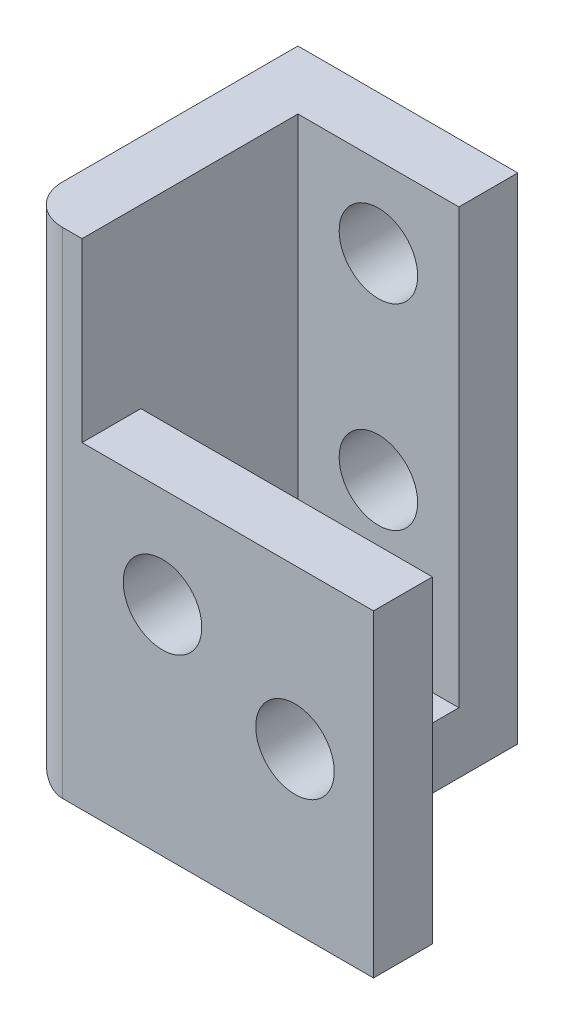
ISO-10303-21;
HEADER;
FILE_DESCRIPTION(('STEP AP214'),'2;1');
FILE_NAME('part.step','',(''),(''),'','','');
FILE_SCHEMA(('AUTOMOTIVE_DESIGN { 1 0 10303 214 1 1 1 1 }'));
ENDSEC;
DATA;
#1=APPLICATION_CONTEXT('core data for automotive mechanical design processes');
#2=APPLICATION_PROTOCOL_DEFINITION('international standard','automotive_design',2000,#1);
#3=PRODUCT_CONTEXT('',#1,'mechanical');
#4=PRODUCT('Part','Part','',(#3));
#5=PRODUCT_RELATED_PRODUCT_CATEGORY('part','',(#4));
#6=PRODUCT_DEFINITION_FORMATION('','',#4);
#7=PRODUCT_DEFINITION_CONTEXT('part definition',#1,'design');
#8=PRODUCT_DEFINITION('design','',#6,#7);
#9=PRODUCT_DEFINITION_SHAPE('','',#8);
#10=(LENGTH_UNIT() NAMED_UNIT(*) SI_UNIT(.MILLI.,.METRE.));
#11=(NAMED_UNIT(*) PLANE_ANGLE_UNIT() SI_UNIT($,.RADIAN.));
#12=(NAMED_UNIT(*) SI_UNIT($,.STERADIAN.) SOLID_ANGLE_UNIT());
#13=UNCERTAINTY_MEASURE_WITH_UNIT(LENGTH_MEASURE(1.E-05),#10,'distance_accuracy_value','');
#14=(GEOMETRIC_REPRESENTATION_CONTEXT(3) GLOBAL_UNCERTAINTY_ASSIGNED_CONTEXT((#13)) GLOBAL_UNIT_ASSIGNED_CONTEXT((#10,
#11,#12)) REPRESENTATION_CONTEXT('',''));
#15=CARTESIAN_POINT('',(0.,0.,0.));
#16=DIRECTION('',(0.,0.,1.));
#17=DIRECTION('',(1.,0.,0.));
#18=AXIS2_PLACEMENT_3D('',#15,#16,#17);
#19=CARTESIAN_POINT('',(-24.25,-5.,5.));
#20=DIRECTION('',(0.,0.,-1.));
#21=DIRECTION('',(-1.,0.,0.));
#22=AXIS2_PLACEMENT_3D('',#19,#20,#21);
#23=CYLINDRICAL_SURFACE('',#22,2.);
#24=CARTESIAN_POINT('',(-24.25,-5.,8.));
#25=DIRECTION('',(0.,0.,1.));
#26=DIRECTION('',(1.,0.,0.));
#27=AXIS2_PLACEMENT_3D('',#24,#25,#26);
#28=CIRCLE('',#27,2.);
#29=CARTESIAN_POINT('',(-22.25,-5.,8.));
#30=VERTEX_POINT('',#29);
#31=EDGE_CURVE('E206',#30,#30,#28,.T.);
#32=ORIENTED_EDGE('',*,*,#31,.T.);
#33=EDGE_LOOP('',(#32));
#34=FACE_BOUND('',#33,.T.);
#35=CARTESIAN_POINT('',(-24.25,-5.,5.));
#36=DIRECTION('',(0.,0.,-1.));
#37=DIRECTION('',(-1.,0.,0.));
#38=AXIS2_PLACEMENT_3D('',#35,#36,#37);
#39=CIRCLE('',#38,2.);
#40=CARTESIAN_POINT('',(-26.25,-5.,5.));
#41=VERTEX_POINT('',#40);
#42=EDGE_CURVE('E11',#41,#41,#39,.T.);
#43=ORIENTED_EDGE('',*,*,#42,.T.);
#44=EDGE_LOOP('',(#43));
#45=FACE_BOUND('',#44,.T.);
#46=ADVANCED_FACE('F37',(#34,#45),#23,.F.);
#47=CARTESIAN_POINT('',(-24.25,5.,5.));
#48=DIRECTION('',(0.,0.,-1.));
#49=DIRECTION('',(-1.,0.,0.));
#50=AXIS2_PLACEMENT_3D('',#47,#48,#49);
#51=CYLINDRICAL_SURFACE('',#50,1.99999999999997);
#52=CARTESIAN_POINT('',(-24.25,5.,8.));
#53=DIRECTION('',(0.,0.,1.));
#54=DIRECTION('',(1.,0.,0.));
#55=AXIS2_PLACEMENT_3D('',#52,#53,#54);
#56=CIRCLE('',#55,1.99999999999997);
#57=CARTESIAN_POINT('',(-22.25,5.,8.));
#58=VERTEX_POINT('',#57);
#59=EDGE_CURVE('E209',#58,#58,#56,.T.);
#60=ORIENTED_EDGE('',*,*,#59,.T.);
#61=EDGE_LOOP('',(#60));
#62=FACE_BOUND('',#61,.T.);
#63=CARTESIAN_POINT('',(-24.25,5.,5.));
#64=DIRECTION('',(0.,0.,-1.));
#65=DIRECTION('',(-1.,0.,0.));
#66=AXIS2_PLACEMENT_3D('',#63,#64,#65);
#67=CIRCLE('',#66,1.99999999999997);
#68=CARTESIAN_POINT('',(-26.25,5.,5.));
#69=VERTEX_POINT('',#68);
#70=EDGE_CURVE('E45',#69,#69,#67,.T.);
#71=ORIENTED_EDGE('',*,*,#70,.T.);
#72=EDGE_LOOP('',(#71));
#73=FACE_BOUND('',#72,.T.);
#74=ADVANCED_FACE('F238',(#62,#73),#51,.F.);
#75=CARTESIAN_POINT('',(0.,0.,8.));
#76=DIRECTION('',(0.,0.,1.));
#77=DIRECTION('',(1.,0.,0.));
#78=AXIS2_PLACEMENT_3D('',#75,#76,#77);
#79=PLANE('',#78);
#80=ORIENTED_EDGE('',*,*,#59,.F.);
#81=EDGE_LOOP('',(#80));
#82=FACE_BOUND('',#81,.T.);
#83=ORIENTED_EDGE('',*,*,#31,.F.);
#84=EDGE_LOOP('',(#83));
#85=FACE_BOUND('',#84,.T.);
#86=DIRECTION('',(0.,-1.,0.));
#87=VECTOR('',#86,1.);
#88=CARTESIAN_POINT('',(-28.35,-9.9,8.));
#89=LINE('',#88,#87);
#90=CARTESIAN_POINT('',(-28.35,9.1,8.));
#91=VERTEX_POINT('',#90);
#92=CARTESIAN_POINT('',(-28.35,-13.,8.));
#93=VERTEX_POINT('',#92);
#94=EDGE_CURVE('E216',#91,#93,#89,.T.);
#95=ORIENTED_EDGE('',*,*,#94,.T.);
#96=DIRECTION('',(-1.,0.,0.));
#97=VECTOR('',#96,1.);
#98=CARTESIAN_POINT('',(-28.35,-13.,8.));
#99=LINE('',#98,#97);
#100=CARTESIAN_POINT('',(-20.15,-13.,8.));
#101=VERTEX_POINT('',#100);
#102=EDGE_CURVE('E154',#101,#93,#99,.T.);
#103=ORIENTED_EDGE('',*,*,#102,.F.);
#104=DIRECTION('',(0.,1.,0.));
#105=VECTOR('',#104,1.);
#106=CARTESIAN_POINT('',(-20.15,-9.9,8.));
#107=LINE('',#106,#105);
#108=CARTESIAN_POINT('',(-20.15,9.1,8.));
#109=VERTEX_POINT('',#108);
#110=EDGE_CURVE('E141',#101,#109,#107,.T.);
#111=ORIENTED_EDGE('',*,*,#110,.T.);
#112=DIRECTION('',(-1.,0.,0.));
#113=VECTOR('',#112,1.);
#114=CARTESIAN_POINT('',(-20.15,9.1,8.));
#115=LINE('',#114,#113);
#116=EDGE_CURVE('E214',#109,#91,#115,.T.);
#117=ORIENTED_EDGE('',*,*,#116,.T.);
#118=EDGE_LOOP('',(#95,#103,#111,#117));
#119=FACE_BOUND('',#118,.T.);
#120=ADVANCED_FACE('F256',(#82,#85,#119),#79,.T.);
#121=CARTESIAN_POINT('',(-28.35,9.1,19.));
#122=DIRECTION('',(-1.,0.,0.));
#123=DIRECTION('',(0.,0.,1.));
#124=AXIS2_PLACEMENT_3D('',#121,#122,#123);
#125=PLANE('',#124);
#126=DIRECTION('',(0.,0.,1.));
#127=VECTOR('',#126,1.);
#128=CARTESIAN_POINT('',(-28.35,-13.,-0.766413177577252));
#129=LINE('',#128,#127);
#130=CARTESIAN_POINT('',(-28.35,-13.,16.));
#131=VERTEX_POINT('',#130);
#132=EDGE_CURVE('E144',#93,#131,#129,.T.);
#133=ORIENTED_EDGE('',*,*,#132,.F.);
#134=ORIENTED_EDGE('',*,*,#94,.F.);
#135=DIRECTION('',(0.,0.,-1.));
#136=VECTOR('',#135,1.);
#137=CARTESIAN_POINT('',(-28.35,9.1,19.));
#138=LINE('',#137,#136);
#139=CARTESIAN_POINT('',(-28.35,9.1,19.));
#140=VERTEX_POINT('',#139);
#141=EDGE_CURVE('E203',#140,#91,#138,.T.);
#142=ORIENTED_EDGE('',*,*,#141,.F.);
#143=DIRECTION('',(0.,1.,0.));
#144=VECTOR('',#143,1.);
#145=CARTESIAN_POINT('',(-28.35,9.1,19.));
#146=LINE('',#145,#144);
#147=CARTESIAN_POINT('',(-28.35,0.0999999999999994,19.));
#148=VERTEX_POINT('',#147);
#149=EDGE_CURVE('E195',#148,#140,#146,.T.);
#150=ORIENTED_EDGE('',*,*,#149,.F.);
#151=DIRECTION('',(0.,0.,1.));
#152=VECTOR('',#151,1.);
#153=CARTESIAN_POINT('',(-28.35,0.0999999999999994,16.));
#154=LINE('',#153,#152);
#155=CARTESIAN_POINT('',(-28.35,0.0999999999999994,16.));
#156=VERTEX_POINT('',#155);
#157=EDGE_CURVE('E186',#156,#148,#154,.T.);
#158=ORIENTED_EDGE('',*,*,#157,.F.);
#159=DIRECTION('',(0.,-1.,0.));
#160=VECTOR('',#159,1.);
#161=CARTESIAN_POINT('',(-28.35,-9.9,16.));
#162=LINE('',#161,#160);
#163=EDGE_CURVE('E171',#156,#131,#162,.T.);
#164=ORIENTED_EDGE('',*,*,#163,.T.);
#165=EDGE_LOOP('',(#133,#134,#142,#150,#158,#164));
#166=FACE_BOUND('',#165,.T.);
#167=ADVANCED_FACE('F276',(#166),#125,.F.);
#168=CARTESIAN_POINT('',(-28.35,-13.,-0.766413177577252));
#169=DIRECTION('',(0.,-1.,0.));
#170=DIRECTION('',(1.,0.,0.));
#171=AXIS2_PLACEMENT_3D('',#168,#169,#170);
#172=PLANE('',#171);
#173=DIRECTION('',(0.,0.,1.));
#174=VECTOR('',#173,1.);
#175=CARTESIAN_POINT('',(-20.15,-13.,-0.766413177577252));
#176=LINE('',#175,#174);
#177=CARTESIAN_POINT('',(-20.15,-13.,16.));
#178=VERTEX_POINT('',#177);
#179=EDGE_CURVE('E135',#101,#178,#176,.T.);
#180=ORIENTED_EDGE('',*,*,#179,.F.);
#181=ORIENTED_EDGE('',*,*,#102,.T.);
#182=ORIENTED_EDGE('',*,*,#132,.T.);
#183=DIRECTION('',(1.,0.,0.));
#184=VECTOR('',#183,1.);
#185=CARTESIAN_POINT('',(-28.35,-13.,16.));
#186=LINE('',#185,#184);
#187=EDGE_CURVE('E129',#131,#178,#186,.T.);
#188=ORIENTED_EDGE('',*,*,#187,.T.);
#189=EDGE_LOOP('',(#180,#181,#182,#188));
#190=FACE_BOUND('',#189,.T.);
#191=ADVANCED_FACE('F147',(#190),#172,.F.);
#192=CARTESIAN_POINT('',(-20.15,0.,5.));
#193=DIRECTION('',(-1.,0.,0.));
#194=DIRECTION('',(0.,0.,1.));
#195=AXIS2_PLACEMENT_3D('',#192,#193,#194);
#196=PLANE('',#195);
#197=DIRECTION('',(0.,1.,0.));
#198=VECTOR('',#197,1.);
#199=CARTESIAN_POINT('',(-20.15,-16.1,5.));
#200=LINE('',#199,#198);
#201=CARTESIAN_POINT('',(-20.15,-16.1,5.));
#202=VERTEX_POINT('',#201);
#203=CARTESIAN_POINT('',(-20.15,9.1,5.));
#204=VERTEX_POINT('',#203);
#205=EDGE_CURVE('E162',#202,#204,#200,.T.);
#206=ORIENTED_EDGE('',*,*,#205,.T.);
#207=DIRECTION('',(0.,0.,-1.));
#208=VECTOR('',#207,1.);
#209=CARTESIAN_POINT('',(-20.15,9.1,8.));
#210=LINE('',#209,#208);
#211=EDGE_CURVE('E219',#109,#204,#210,.T.);
#212=ORIENTED_EDGE('',*,*,#211,.F.);
#213=ORIENTED_EDGE('',*,*,#110,.F.);
#214=ORIENTED_EDGE('',*,*,#179,.T.);
#215=DIRECTION('',(0.,-1.,0.));
#216=VECTOR('',#215,1.);
#217=CARTESIAN_POINT('',(-20.15,-16.1,16.));
#218=LINE('',#217,#216);
#219=CARTESIAN_POINT('',(-20.15,-16.1,16.));
#220=VERTEX_POINT('',#219);
#221=EDGE_CURVE('E125',#178,#220,#218,.T.);
#222=ORIENTED_EDGE('',*,*,#221,.T.);
#223=DIRECTION('',(0.,0.,1.));
#224=VECTOR('',#223,1.);
#225=CARTESIAN_POINT('',(-20.15,-16.1,5.));
#226=LINE('',#225,#224);
#227=EDGE_CURVE('E160',#202,#220,#226,.T.);
#228=ORIENTED_EDGE('',*,*,#227,.F.);
#229=EDGE_LOOP('',(#206,#212,#213,#214,#222,#228));
#230=FACE_BOUND('',#229,.T.);
#231=ADVANCED_FACE('F139',(#230),#196,.F.);
#232=CARTESIAN_POINT('',(-17.5,-8.,16.));
#233=DIRECTION('',(0.,0.,1.));
#234=DIRECTION('',(1.,0.,0.));
#235=AXIS2_PLACEMENT_3D('',#232,#233,#234);
#236=CYLINDRICAL_SURFACE('',#235,2.);
#237=CARTESIAN_POINT('',(-17.5,-8.,16.));
#238=DIRECTION('',(0.,0.,1.));
#239=DIRECTION('',(1.,0.,0.));
#240=AXIS2_PLACEMENT_3D('',#237,#238,#239);
#241=CIRCLE('',#240,2.);
#242=CARTESIAN_POINT('',(-15.5,-8.,16.));
#243=VERTEX_POINT('',#242);
#244=EDGE_CURVE('E165',#243,#243,#241,.T.);
#245=ORIENTED_EDGE('',*,*,#244,.F.);
#246=EDGE_LOOP('',(#245));
#247=FACE_BOUND('',#246,.T.);
#248=CARTESIAN_POINT('',(-17.5,-8.,19.));
#249=DIRECTION('',(0.,0.,1.));
#250=DIRECTION('',(1.,0.,0.));
#251=AXIS2_PLACEMENT_3D('',#248,#249,#250);
#252=CIRCLE('',#251,2.);
#253=CARTESIAN_POINT('',(-15.5,-8.,19.));
#254=VERTEX_POINT('',#253);
#255=EDGE_CURVE('E164',#254,#254,#252,.T.);
#256=ORIENTED_EDGE('',*,*,#255,.T.);
#257=EDGE_LOOP('',(#256));
#258=FACE_BOUND('',#257,.T.);
#259=ADVANCED_FACE('F296',(#247,#258),#236,.F.);
#260=CARTESIAN_POINT('',(-24.25,-5.,40.4460894756599));
#261=DIRECTION('',(0.,0.,-1.));
#262=DIRECTION('',(-1.,0.,0.));
#263=AXIS2_PLACEMENT_3D('',#260,#261,#262);
#264=CYLINDRICAL_SURFACE('',#263,2.);
#265=CARTESIAN_POINT('',(-24.25,-5.,16.));
#266=DIRECTION('',(0.,0.,-1.));
#267=DIRECTION('',(-1.,0.,0.));
#268=AXIS2_PLACEMENT_3D('',#265,#266,#267);
#269=CIRCLE('',#268,2.);
#270=CARTESIAN_POINT('',(-26.25,-5.,16.));
#271=VERTEX_POINT('',#270);
#272=EDGE_CURVE('E151',#271,#271,#269,.T.);
#273=ORIENTED_EDGE('',*,*,#272,.T.);
#274=EDGE_LOOP('',(#273));
#275=FACE_BOUND('',#274,.T.);
#276=CARTESIAN_POINT('',(-24.25,-5.,19.));
#277=DIRECTION('',(0.,0.,-1.));
#278=DIRECTION('',(-1.,0.,0.));
#279=AXIS2_PLACEMENT_3D('',#276,#277,#278);
#280=CIRCLE('',#279,2.);
#281=CARTESIAN_POINT('',(-26.25,-5.,19.));
#282=VERTEX_POINT('',#281);
#283=EDGE_CURVE('E148',#282,#282,#280,.T.);
#284=ORIENTED_EDGE('',*,*,#283,.F.);
#285=EDGE_LOOP('',(#284));
#286=FACE_BOUND('',#285,.T.);
#287=ADVANCED_FACE('F291',(#275,#286),#264,.F.);
#288=CARTESIAN_POINT('',(-28.35,0.0999999999999994,16.));
#289=DIRECTION('',(0.,1.,0.));
#290=DIRECTION('',(0.,0.,1.));
#291=AXIS2_PLACEMENT_3D('',#288,#289,#290);
#292=PLANE('',#291);
#293=DIRECTION('',(-1.,0.,0.));
#294=VECTOR('',#293,1.);
#295=CARTESIAN_POINT('',(-28.35,0.0999999999999994,19.));
#296=LINE('',#295,#294);
#297=CARTESIAN_POINT('',(-13.5,0.0999999999999994,19.));
#298=VERTEX_POINT('',#297);
#299=EDGE_CURVE('E173',#298,#148,#296,.T.);
#300=ORIENTED_EDGE('',*,*,#299,.F.);
#301=DIRECTION('',(0.,0.,1.));
#302=VECTOR('',#301,1.);
#303=CARTESIAN_POINT('',(-13.5,0.0999999999999994,16.));
#304=LINE('',#303,#302);
#305=CARTESIAN_POINT('',(-13.5,0.0999999999999994,16.));
#306=VERTEX_POINT('',#305);
#307=EDGE_CURVE('E190',#306,#298,#304,.T.);
#308=ORIENTED_EDGE('',*,*,#307,.F.);
#309=DIRECTION('',(-1.,0.,0.));
#310=VECTOR('',#309,1.);
#311=CARTESIAN_POINT('',(-28.35,0.0999999999999994,16.));
#312=LINE('',#311,#310);
#313=EDGE_CURVE('E177',#306,#156,#312,.T.);
#314=ORIENTED_EDGE('',*,*,#313,.T.);
#315=ORIENTED_EDGE('',*,*,#157,.T.);
#316=EDGE_LOOP('',(#300,#308,#314,#315));
#317=FACE_BOUND('',#316,.T.);
#318=ADVANCED_FACE('F288',(#317),#292,.T.);
#319=CARTESIAN_POINT('',(0.,0.,16.));
#320=DIRECTION('',(0.,0.,1.));
#321=DIRECTION('',(1.,0.,0.));
#322=AXIS2_PLACEMENT_3D('',#319,#320,#321);
#323=PLANE('',#322);
#324=ORIENTED_EDGE('',*,*,#272,.F.);
#325=EDGE_LOOP('',(#324));
#326=FACE_BOUND('',#325,.T.);
#327=ORIENTED_EDGE('',*,*,#244,.T.);
#328=EDGE_LOOP('',(#327));
#329=FACE_BOUND('',#328,.T.);
#330=ORIENTED_EDGE('',*,*,#221,.F.);
#331=ORIENTED_EDGE('',*,*,#187,.F.);
#332=ORIENTED_EDGE('',*,*,#163,.F.);
#333=ORIENTED_EDGE('',*,*,#313,.F.);
#334=DIRECTION('',(0.,1.,0.));
#335=VECTOR('',#334,1.);
#336=CARTESIAN_POINT('',(-13.5,-9.9,16.));
#337=LINE('',#336,#335);
#338=CARTESIAN_POINT('',(-13.5,-16.1,16.));
#339=VERTEX_POINT('',#338);
#340=EDGE_CURVE('E175',#339,#306,#337,.T.);
#341=ORIENTED_EDGE('',*,*,#340,.F.);
#342=DIRECTION('',(1.,0.,0.));
#343=VECTOR('',#342,1.);
#344=CARTESIAN_POINT('',(-28.35,-16.1,16.));
#345=LINE('',#344,#343);
#346=EDGE_CURVE('E132',#220,#339,#345,.T.);
#347=ORIENTED_EDGE('',*,*,#346,.F.);
#348=EDGE_LOOP('',(#330,#331,#332,#333,#341,#347));
#349=FACE_BOUND('',#348,.T.);
#350=ADVANCED_FACE('F127',(#326,#329,#349),#323,.F.);
#351=CARTESIAN_POINT('',(0.,0.,19.));
#352=DIRECTION('',(0.,0.,-1.));
#353=DIRECTION('',(-1.,0.,0.));
#354=AXIS2_PLACEMENT_3D('',#351,#352,#353);
#355=PLANE('',#354);
#356=ORIENTED_EDGE('',*,*,#283,.T.);
#357=EDGE_LOOP('',(#356));
#358=FACE_BOUND('',#357,.T.);
#359=DIRECTION('',(-1.,0.,0.));
#360=VECTOR('',#359,1.);
#361=CARTESIAN_POINT('',(-28.35,9.1,19.));
#362=LINE('',#361,#360);
#363=CARTESIAN_POINT('',(-29.35,9.1,19.));
#364=VERTEX_POINT('',#363);
#365=EDGE_CURVE('E197',#140,#364,#362,.T.);
#366=ORIENTED_EDGE('',*,*,#365,.T.);
#367=DIRECTION('',(0.,-1.,0.));
#368=VECTOR('',#367,1.);
#369=CARTESIAN_POINT('',(-29.35,0.,19.));
#370=LINE('',#369,#368);
#371=CARTESIAN_POINT('',(-29.35,-16.1,19.));
#372=VERTEX_POINT('',#371);
#373=EDGE_CURVE('E222',#364,#372,#370,.T.);
#374=ORIENTED_EDGE('',*,*,#373,.T.);
#375=DIRECTION('',(1.,0.,0.));
#376=VECTOR('',#375,1.);
#377=CARTESIAN_POINT('',(-28.35,-16.1,19.));
#378=LINE('',#377,#376);
#379=CARTESIAN_POINT('',(-13.5,-16.1,19.));
#380=VERTEX_POINT('',#379);
#381=EDGE_CURVE('E168',#372,#380,#378,.T.);
#382=ORIENTED_EDGE('',*,*,#381,.T.);
#383=DIRECTION('',(0.,1.,0.));
#384=VECTOR('',#383,1.);
#385=CARTESIAN_POINT('',(-13.5,-9.9,19.));
#386=LINE('',#385,#384);
#387=EDGE_CURVE('E182',#380,#298,#386,.T.);
#388=ORIENTED_EDGE('',*,*,#387,.T.);
#389=ORIENTED_EDGE('',*,*,#299,.T.);
#390=ORIENTED_EDGE('',*,*,#149,.T.);
#391=EDGE_LOOP('',(#366,#374,#382,#388,#389,#390));
#392=FACE_BOUND('',#391,.T.);
#393=ORIENTED_EDGE('',*,*,#255,.F.);
#394=EDGE_LOOP('',(#393));
#395=FACE_BOUND('',#394,.T.);
#396=ADVANCED_FACE('F284',(#358,#392,#395),#355,.F.);
#397=CARTESIAN_POINT('',(-29.35,-14.1,16.));
#398=DIRECTION('',(0.,0.,1.));
#399=DIRECTION('',(1.,0.,0.));
#400=AXIS2_PLACEMENT_3D('',#397,#398,#399);
#401=CYLINDRICAL_SURFACE('',#400,2.);
#402=CARTESIAN_POINT('',(-29.35,-14.1,5.));
#403=DIRECTION('',(0.,0.,1.));
#404=DIRECTION('',(1.,0.,0.));
#405=AXIS2_PLACEMENT_3D('',#402,#403,#404);
#406=CIRCLE('',#405,2.);
#407=CARTESIAN_POINT('',(-29.35,-16.1,5.));
#408=VERTEX_POINT('',#407);
#409=CARTESIAN_POINT('',(-31.35,-14.1,5.));
#410=VERTEX_POINT('',#409);
#411=EDGE_CURVE('E232',#408,#410,#406,.F.);
#412=ORIENTED_EDGE('',*,*,#411,.F.);
#413=DIRECTION('',(0.,0.,-1.));
#414=VECTOR('',#413,1.);
#415=CARTESIAN_POINT('',(-29.35,-16.1,5.));
#416=LINE('',#415,#414);
#417=EDGE_CURVE('E52',#372,#408,#416,.T.);
#418=ORIENTED_EDGE('',*,*,#417,.F.);
#419=CARTESIAN_POINT('',(-29.35,-14.1,17.));
#420=DIRECTION('',(0.,0.707106781186547,0.707106781186547));
#421=DIRECTION('',(0.,-0.707106781186547,0.707106781186547));
#422=AXIS2_PLACEMENT_3D('',#419,#420,#421);
#423=ELLIPSE('',#422,2.82842712474619,2.);
#424=CARTESIAN_POINT('',(-31.35,-14.1,17.));
#425=VERTEX_POINT('',#424);
#426=EDGE_CURVE('E234',#425,#372,#423,.T.);
#427=ORIENTED_EDGE('',*,*,#426,.F.);
#428=DIRECTION('',(0.,0.,-1.));
#429=VECTOR('',#428,1.);
#430=CARTESIAN_POINT('',(-31.35,-14.1,19.));
#431=LINE('',#430,#429);
#432=EDGE_CURVE('E60',#410,#425,#431,.F.);
#433=ORIENTED_EDGE('',*,*,#432,.F.);
#434=EDGE_LOOP('',(#412,#418,#427,#433));
#435=FACE_BOUND('',#434,.T.);
#436=ADVANCED_FACE('F39',(#435),#401,.T.);
#437=CARTESIAN_POINT('',(-31.35,9.1,19.));
#438=DIRECTION('',(1.,0.,0.));
#439=DIRECTION('',(0.,0.,-1.));
#440=AXIS2_PLACEMENT_3D('',#437,#438,#439);
#441=PLANE('',#440);
#442=ORIENTED_EDGE('',*,*,#432,.T.);
#443=DIRECTION('',(0.,-1.,0.));
#444=VECTOR('',#443,1.);
#445=CARTESIAN_POINT('',(-31.35,9.1,17.));
#446=LINE('',#445,#444);
#447=CARTESIAN_POINT('',(-31.35,9.1,17.));
#448=VERTEX_POINT('',#447);
#449=EDGE_CURVE('E227',#425,#448,#446,.F.);
#450=ORIENTED_EDGE('',*,*,#449,.T.);
#451=DIRECTION('',(0.,0.,-1.));
#452=VECTOR('',#451,1.);
#453=CARTESIAN_POINT('',(-31.35,9.1,19.));
#454=LINE('',#453,#452);
#455=CARTESIAN_POINT('',(-31.35,9.1,5.));
#456=VERTEX_POINT('',#455);
#457=EDGE_CURVE('E200',#448,#456,#454,.T.);
#458=ORIENTED_EDGE('',*,*,#457,.T.);
#459=DIRECTION('',(0.,-1.,0.));
#460=VECTOR('',#459,1.);
#461=CARTESIAN_POINT('',(-31.35,9.1,5.));
#462=LINE('',#461,#460);
#463=EDGE_CURVE('E189',#456,#410,#462,.T.);
#464=ORIENTED_EDGE('',*,*,#463,.T.);
#465=EDGE_LOOP('',(#442,#450,#458,#464));
#466=FACE_BOUND('',#465,.T.);
#467=ADVANCED_FACE('F281',(#466),#441,.F.);
#468=CARTESIAN_POINT('',(-29.35,0.,17.));
#469=DIRECTION('',(0.,-1.,0.));
#470=DIRECTION('',(0.,0.,-1.));
#471=AXIS2_PLACEMENT_3D('',#468,#469,#470);
#472=CYLINDRICAL_SURFACE('',#471,2.);
#473=CARTESIAN_POINT('',(-29.35,9.1,17.));
#474=DIRECTION('',(0.,-1.,0.));
#475=DIRECTION('',(0.,0.,-1.));
#476=AXIS2_PLACEMENT_3D('',#473,#474,#475);
#477=CIRCLE('',#476,2.);
#478=EDGE_CURVE('E229',#448,#364,#477,.F.);
#479=ORIENTED_EDGE('',*,*,#478,.F.);
#480=ORIENTED_EDGE('',*,*,#449,.F.);
#481=ORIENTED_EDGE('',*,*,#426,.T.);
#482=ORIENTED_EDGE('',*,*,#373,.F.);
#483=EDGE_LOOP('',(#479,#480,#481,#482));
#484=FACE_BOUND('',#483,.T.);
#485=ADVANCED_FACE('F269',(#484),#472,.T.);
#486=CARTESIAN_POINT('',(-13.5,-9.9,16.));
#487=DIRECTION('',(1.,0.,0.));
#488=DIRECTION('',(0.,0.,-1.));
#489=AXIS2_PLACEMENT_3D('',#486,#487,#488);
#490=PLANE('',#489);
#491=ORIENTED_EDGE('',*,*,#387,.F.);
#492=DIRECTION('',(0.,0.,1.));
#493=VECTOR('',#492,1.);
#494=CARTESIAN_POINT('',(-13.5,-16.1,16.));
#495=LINE('',#494,#493);
#496=EDGE_CURVE('E180',#339,#380,#495,.T.);
#497=ORIENTED_EDGE('',*,*,#496,.F.);
#498=ORIENTED_EDGE('',*,*,#340,.T.);
#499=ORIENTED_EDGE('',*,*,#307,.T.);
#500=EDGE_LOOP('',(#491,#497,#498,#499));
#501=FACE_BOUND('',#500,.T.);
#502=ADVANCED_FACE('F261',(#501),#490,.T.);
#503=CARTESIAN_POINT('',(-20.15,9.1,8.));
#504=DIRECTION('',(0.,-1.,0.));
#505=DIRECTION('',(0.,0.,-1.));
#506=AXIS2_PLACEMENT_3D('',#503,#504,#505);
#507=PLANE('',#506);
#508=ORIENTED_EDGE('',*,*,#457,.F.);
#509=ORIENTED_EDGE('',*,*,#478,.T.);
#510=ORIENTED_EDGE('',*,*,#365,.F.);
#511=ORIENTED_EDGE('',*,*,#141,.T.);
#512=ORIENTED_EDGE('',*,*,#116,.F.);
#513=ORIENTED_EDGE('',*,*,#211,.T.);
#514=DIRECTION('',(-1.,0.,0.));
#515=VECTOR('',#514,1.);
#516=CARTESIAN_POINT('',(-20.15,9.1,5.));
#517=LINE('',#516,#515);
#518=EDGE_CURVE('E212',#204,#456,#517,.T.);
#519=ORIENTED_EDGE('',*,*,#518,.T.);
#520=EDGE_LOOP('',(#508,#509,#510,#511,#512,#513,#519));
#521=FACE_BOUND('',#520,.T.);
#522=ADVANCED_FACE('F251',(#521),#507,.F.);
#523=CARTESIAN_POINT('',(-28.35,-16.1,16.));
#524=DIRECTION('',(0.,-1.,0.));
#525=DIRECTION('',(0.,0.,-1.));
#526=AXIS2_PLACEMENT_3D('',#523,#524,#525);
#527=PLANE('',#526);
#528=ORIENTED_EDGE('',*,*,#381,.F.);
#529=ORIENTED_EDGE('',*,*,#417,.T.);
#530=DIRECTION('',(1.,0.,0.));
#531=VECTOR('',#530,1.);
#532=CARTESIAN_POINT('',(-24.25,-16.1,5.));
#533=LINE('',#532,#531);
#534=EDGE_CURVE('E158',#408,#202,#533,.T.);
#535=ORIENTED_EDGE('',*,*,#534,.T.);
#536=ORIENTED_EDGE('',*,*,#227,.T.);
#537=ORIENTED_EDGE('',*,*,#346,.T.);
#538=ORIENTED_EDGE('',*,*,#496,.T.);
#539=EDGE_LOOP('',(#528,#529,#535,#536,#537,#538));
#540=FACE_BOUND('',#539,.T.);
#541=ADVANCED_FACE('F243',(#540),#527,.T.);
#542=CARTESIAN_POINT('',(0.,0.,5.));
#543=DIRECTION('',(0.,0.,1.));
#544=DIRECTION('',(1.,0.,0.));
#545=AXIS2_PLACEMENT_3D('',#542,#543,#544);
#546=PLANE('',#545);
#547=ORIENTED_EDGE('',*,*,#463,.F.);
#548=ORIENTED_EDGE('',*,*,#518,.F.);
#549=ORIENTED_EDGE('',*,*,#205,.F.);
#550=ORIENTED_EDGE('',*,*,#534,.F.);
#551=ORIENTED_EDGE('',*,*,#411,.T.);
#552=EDGE_LOOP('',(#547,#548,#549,#550,#551));
#553=FACE_BOUND('',#552,.T.);
#554=ORIENTED_EDGE('',*,*,#70,.F.);
#555=EDGE_LOOP('',(#554));
#556=FACE_BOUND('',#555,.T.);
#557=ORIENTED_EDGE('',*,*,#42,.F.);
#558=EDGE_LOOP('',(#557));
#559=FACE_BOUND('',#558,.T.);
#560=ADVANCED_FACE('F240',(#553,#556,#559),#546,.F.);
#561=CLOSED_SHELL('',(#46,#74,#120,#167,#191,#231,#259,#287,#318,#350,#396,#436,#467,#485,#502,
#522,#541,#560));
#562=MANIFOLD_SOLID_BREP('B2',#561);
#563=ADVANCED_BREP_SHAPE_REPRESENTATION('',(#18,#562),#14);
#564=SHAPE_DEFINITION_REPRESENTATION(#9,#563);
ENDSEC;
END-ISO-10303-21;
